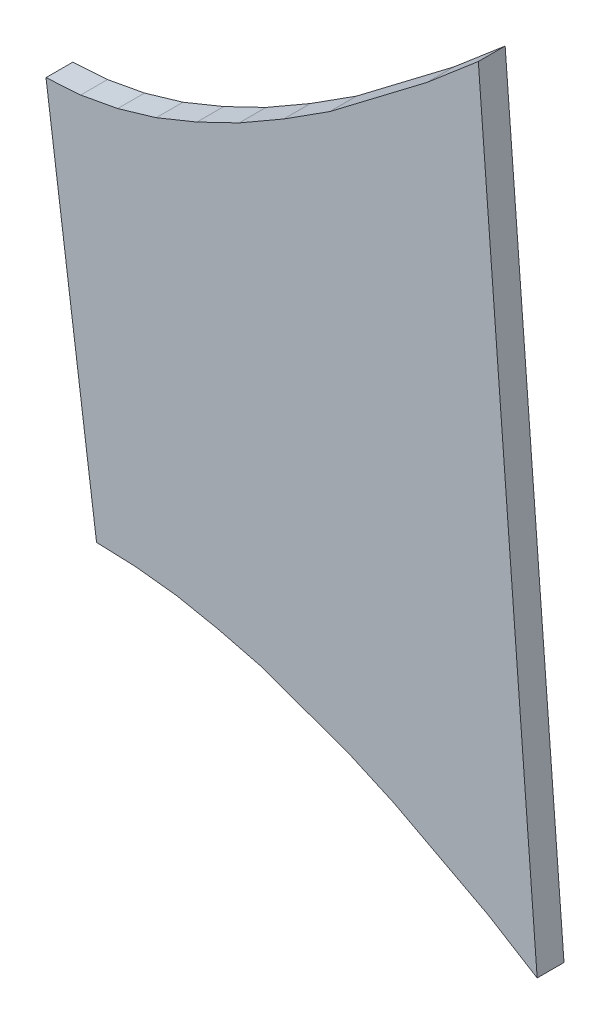
ISO-10303-21;
HEADER;
FILE_DESCRIPTION(('STEP AP214'),'2;1');
FILE_NAME('part.step','',(''),(''),'','','');
FILE_SCHEMA(('AUTOMOTIVE_DESIGN { 1 0 10303 214 1 1 1 1 }'));
ENDSEC;
DATA;
#1=APPLICATION_CONTEXT('core data for automotive mechanical design processes');
#2=APPLICATION_PROTOCOL_DEFINITION('international standard','automotive_design',2000,#1);
#3=PRODUCT_CONTEXT('',#1,'mechanical');
#4=PRODUCT('Part','Part','',(#3));
#5=PRODUCT_RELATED_PRODUCT_CATEGORY('part','',(#4));
#6=PRODUCT_DEFINITION_FORMATION('','',#4);
#7=PRODUCT_DEFINITION_CONTEXT('part definition',#1,'design');
#8=PRODUCT_DEFINITION('design','',#6,#7);
#9=PRODUCT_DEFINITION_SHAPE('','',#8);
#10=(LENGTH_UNIT() NAMED_UNIT(*) SI_UNIT(.MILLI.,.METRE.));
#11=(NAMED_UNIT(*) PLANE_ANGLE_UNIT() SI_UNIT($,.RADIAN.));
#12=(NAMED_UNIT(*) SI_UNIT($,.STERADIAN.) SOLID_ANGLE_UNIT());
#13=UNCERTAINTY_MEASURE_WITH_UNIT(LENGTH_MEASURE(1.E-05),#10,'distance_accuracy_value','');
#14=(GEOMETRIC_REPRESENTATION_CONTEXT(3) GLOBAL_UNCERTAINTY_ASSIGNED_CONTEXT((#13)) GLOBAL_UNIT_ASSIGNED_CONTEXT((#10,
#11,#12)) REPRESENTATION_CONTEXT('',''));
#15=CARTESIAN_POINT('',(0.,0.,0.));
#16=DIRECTION('',(0.,0.,1.));
#17=DIRECTION('',(1.,0.,0.));
#18=AXIS2_PLACEMENT_3D('',#15,#16,#17);
#19=CARTESIAN_POINT('',(57.4749984741211,95.1719970703125,0.));
#20=DIRECTION('',(0.038410600738388,0.999262040583408,0.));
#21=DIRECTION('',(0.999262040583408,-0.038410600738388,0.));
#22=AXIS2_PLACEMENT_3D('',#19,#20,#21);
#23=PLANE('',#22);
#24=DIRECTION('',(0.999262040583408,-0.038410600738388,0.));
#25=VECTOR('',#24,1.);
#26=CARTESIAN_POINT('',(57.4749984741211,95.1719970703125,0.03556));
#27=LINE('',#26,#25);
#28=CARTESIAN_POINT('',(57.4749984741211,95.1719970703125,0.03556));
#29=VERTEX_POINT('',#28);
#30=CARTESIAN_POINT('',(57.5270004272461,95.1699981689453,0.03556));
#31=VERTEX_POINT('',#30);
#32=EDGE_CURVE('E11',#29,#31,#27,.T.);
#33=ORIENTED_EDGE('',*,*,#32,.F.);
#34=DIRECTION('',(0.,0.,1.));
#35=VECTOR('',#34,1.);
#36=CARTESIAN_POINT('',(57.4749984741211,95.1719970703125,0.));
#37=LINE('',#36,#35);
#38=CARTESIAN_POINT('',(57.4749984741211,95.1719970703125,0.));
#39=VERTEX_POINT('',#38);
#40=EDGE_CURVE('E24',#39,#29,#37,.T.);
#41=ORIENTED_EDGE('',*,*,#40,.F.);
#42=DIRECTION('',(0.999262040583408,-0.038410600738388,0.));
#43=VECTOR('',#42,1.);
#44=CARTESIAN_POINT('',(57.4749984741211,95.1719970703125,0.));
#45=LINE('',#44,#43);
#46=CARTESIAN_POINT('',(57.5270004272461,95.1699981689453,0.));
#47=VERTEX_POINT('',#46);
#48=EDGE_CURVE('E166',#39,#47,#45,.T.);
#49=ORIENTED_EDGE('',*,*,#48,.T.);
#50=DIRECTION('',(0.,0.,1.));
#51=VECTOR('',#50,1.);
#52=CARTESIAN_POINT('',(57.5270004272461,95.1699981689453,0.));
#53=LINE('',#52,#51);
#54=EDGE_CURVE('E37',#47,#31,#53,.T.);
#55=ORIENTED_EDGE('',*,*,#54,.T.);
#56=EDGE_LOOP('',(#33,#41,#49,#55));
#57=FACE_BOUND('',#56,.T.);
#58=ADVANCED_FACE('F17',(#57),#23,.F.);
#59=CARTESIAN_POINT('',(57.5270004272461,95.1699981689453,0.));
#60=DIRECTION('',(0.110369878192597,0.993890582502798,0.));
#61=DIRECTION('',(0.993890582502798,-0.110369878192597,0.));
#62=AXIS2_PLACEMENT_3D('',#59,#60,#61);
#63=PLANE('',#62);
#64=DIRECTION('',(0.993890582502798,-0.110369878192597,0.));
#65=VECTOR('',#64,1.);
#66=CARTESIAN_POINT('',(57.5270004272461,95.1699981689453,0.03556));
#67=LINE('',#66,#65);
#68=CARTESIAN_POINT('',(57.5810012817383,95.1640014648438,0.03556));
#69=VERTEX_POINT('',#68);
#70=EDGE_CURVE('E294',#31,#69,#67,.T.);
#71=ORIENTED_EDGE('',*,*,#70,.F.);
#72=ORIENTED_EDGE('',*,*,#54,.F.);
#73=DIRECTION('',(0.993890582502798,-0.110369878192597,0.));
#74=VECTOR('',#73,1.);
#75=CARTESIAN_POINT('',(57.5270004272461,95.1699981689453,0.));
#76=LINE('',#75,#74);
#77=CARTESIAN_POINT('',(57.5810012817383,95.1640014648438,0.));
#78=VERTEX_POINT('',#77);
#79=EDGE_CURVE('E291',#47,#78,#76,.T.);
#80=ORIENTED_EDGE('',*,*,#79,.T.);
#81=DIRECTION('',(0.,0.,1.));
#82=VECTOR('',#81,1.);
#83=CARTESIAN_POINT('',(57.5810012817383,95.1640014648438,0.));
#84=LINE('',#83,#82);
#85=EDGE_CURVE('E289',#78,#69,#84,.T.);
#86=ORIENTED_EDGE('',*,*,#85,.T.);
#87=EDGE_LOOP('',(#71,#72,#80,#86));
#88=FACE_BOUND('',#87,.T.);
#89=ADVANCED_FACE('F302',(#88),#63,.F.);
#90=CARTESIAN_POINT('',(57.5810012817383,95.1640014648438,0.));
#91=DIRECTION('',(0.196142292954482,0.980575443764812,0.));
#92=DIRECTION('',(0.980575443764812,-0.196142292954482,0.));
#93=AXIS2_PLACEMENT_3D('',#90,#91,#92);
#94=PLANE('',#93);
#95=DIRECTION('',(0.980575443764812,-0.196142292954482,0.));
#96=VECTOR('',#95,1.);
#97=CARTESIAN_POINT('',(57.5810012817383,95.1640014648438,0.03556));
#98=LINE('',#97,#96);
#99=CARTESIAN_POINT('',(57.6360015869141,95.1529998779297,0.03556));
#100=VERTEX_POINT('',#99);
#101=EDGE_CURVE('E286',#69,#100,#98,.T.);
#102=ORIENTED_EDGE('',*,*,#101,.F.);
#103=ORIENTED_EDGE('',*,*,#85,.F.);
#104=DIRECTION('',(0.980575443764812,-0.196142292954482,0.));
#105=VECTOR('',#104,1.);
#106=CARTESIAN_POINT('',(57.5810012817383,95.1640014648438,0.));
#107=LINE('',#106,#105);
#108=CARTESIAN_POINT('',(57.6360015869141,95.1529998779297,0.));
#109=VERTEX_POINT('',#108);
#110=EDGE_CURVE('E283',#78,#109,#107,.T.);
#111=ORIENTED_EDGE('',*,*,#110,.T.);
#112=DIRECTION('',(0.,0.,1.));
#113=VECTOR('',#112,1.);
#114=CARTESIAN_POINT('',(57.6360015869141,95.1529998779297,0.));
#115=LINE('',#114,#113);
#116=EDGE_CURVE('E281',#109,#100,#115,.T.);
#117=ORIENTED_EDGE('',*,*,#116,.T.);
#118=EDGE_LOOP('',(#102,#103,#111,#117));
#119=FACE_BOUND('',#118,.T.);
#120=ADVANCED_FACE('F308',(#119),#94,.F.);
#121=CARTESIAN_POINT('',(57.6360015869141,95.1529998779297,0.));
#122=DIRECTION('',(0.242535625036333,0.970142500145332,0.));
#123=DIRECTION('',(0.970142500145332,-0.242535625036333,0.));
#124=AXIS2_PLACEMENT_3D('',#121,#122,#123);
#125=PLANE('',#124);
#126=DIRECTION('',(0.970142500145332,-0.242535625036333,0.));
#127=VECTOR('',#126,1.);
#128=CARTESIAN_POINT('',(57.6360015869141,95.1529998779297,0.03556));
#129=LINE('',#128,#127);
#130=CARTESIAN_POINT('',(57.6920013427734,95.1389999389648,0.03556));
#131=VERTEX_POINT('',#130);
#132=EDGE_CURVE('E278',#100,#131,#129,.T.);
#133=ORIENTED_EDGE('',*,*,#132,.F.);
#134=ORIENTED_EDGE('',*,*,#116,.F.);
#135=DIRECTION('',(0.970142500145332,-0.242535625036333,0.));
#136=VECTOR('',#135,1.);
#137=CARTESIAN_POINT('',(57.6360015869141,95.1529998779297,0.));
#138=LINE('',#137,#136);
#139=CARTESIAN_POINT('',(57.6920013427734,95.1389999389648,0.));
#140=VERTEX_POINT('',#139);
#141=EDGE_CURVE('E275',#109,#140,#138,.T.);
#142=ORIENTED_EDGE('',*,*,#141,.T.);
#143=DIRECTION('',(0.,0.,1.));
#144=VECTOR('',#143,1.);
#145=CARTESIAN_POINT('',(57.6920013427734,95.1389999389648,0.));
#146=LINE('',#145,#144);
#147=EDGE_CURVE('E273',#140,#131,#146,.T.);
#148=ORIENTED_EDGE('',*,*,#147,.T.);
#149=EDGE_LOOP('',(#133,#134,#142,#148));
#150=FACE_BOUND('',#149,.T.);
#151=ADVANCED_FACE('F310',(#150),#125,.F.);
#152=CARTESIAN_POINT('',(57.6920013427734,95.1389999389648,0.));
#153=DIRECTION('',(0.337871724015793,0.941192168534458,0.));
#154=DIRECTION('',(0.941192168534458,-0.337871724015793,0.));
#155=AXIS2_PLACEMENT_3D('',#152,#153,#154);
#156=PLANE('',#155);
#157=DIRECTION('',(0.941192168534458,-0.337871724015793,0.));
#158=VECTOR('',#157,1.);
#159=CARTESIAN_POINT('',(57.6920013427734,95.1389999389648,0.03556));
#160=LINE('',#159,#158);
#161=CARTESIAN_POINT('',(57.8089981079102,95.0970001220703,0.03556));
#162=VERTEX_POINT('',#161);
#163=EDGE_CURVE('E270',#131,#162,#160,.T.);
#164=ORIENTED_EDGE('',*,*,#163,.F.);
#165=ORIENTED_EDGE('',*,*,#147,.F.);
#166=DIRECTION('',(0.941192168534458,-0.337871724015793,0.));
#167=VECTOR('',#166,1.);
#168=CARTESIAN_POINT('',(57.6920013427734,95.1389999389648,0.));
#169=LINE('',#168,#167);
#170=CARTESIAN_POINT('',(57.8089981079102,95.0970001220703,0.));
#171=VERTEX_POINT('',#170);
#172=EDGE_CURVE('E267',#140,#171,#169,.T.);
#173=ORIENTED_EDGE('',*,*,#172,.T.);
#174=DIRECTION('',(0.,0.,1.));
#175=VECTOR('',#174,1.);
#176=CARTESIAN_POINT('',(57.8089981079102,95.0970001220703,0.));
#177=LINE('',#176,#175);
#178=EDGE_CURVE('E265',#171,#162,#177,.T.);
#179=ORIENTED_EDGE('',*,*,#178,.T.);
#180=EDGE_LOOP('',(#164,#165,#173,#179));
#181=FACE_BOUND('',#180,.T.);
#182=ADVANCED_FACE('F315',(#181),#156,.F.);
#183=CARTESIAN_POINT('',(57.8089981079102,95.0970001220703,0.));
#184=DIRECTION('',(0.410362266635063,0.911922589983456,0.));
#185=DIRECTION('',(0.911922589983456,-0.410362266635063,0.));
#186=AXIS2_PLACEMENT_3D('',#183,#184,#185);
#187=PLANE('',#186);
#188=DIRECTION('',(0.911922589983456,-0.410362266635063,0.));
#189=VECTOR('',#188,1.);
#190=CARTESIAN_POINT('',(57.8089981079102,95.0970001220703,0.03556));
#191=LINE('',#190,#189);
#192=CARTESIAN_POINT('',(57.8689994812012,95.0699996948242,0.03556));
#193=VERTEX_POINT('',#192);
#194=EDGE_CURVE('E262',#162,#193,#191,.T.);
#195=ORIENTED_EDGE('',*,*,#194,.F.);
#196=ORIENTED_EDGE('',*,*,#178,.F.);
#197=DIRECTION('',(0.911922589983456,-0.410362266635063,0.));
#198=VECTOR('',#197,1.);
#199=CARTESIAN_POINT('',(57.8089981079102,95.0970001220703,0.));
#200=LINE('',#199,#198);
#201=CARTESIAN_POINT('',(57.8689994812012,95.0699996948242,0.));
#202=VERTEX_POINT('',#201);
#203=EDGE_CURVE('E259',#171,#202,#200,.T.);
#204=ORIENTED_EDGE('',*,*,#203,.T.);
#205=DIRECTION('',(0.,0.,1.));
#206=VECTOR('',#205,1.);
#207=CARTESIAN_POINT('',(57.8689994812012,95.0699996948242,0.));
#208=LINE('',#207,#206);
#209=EDGE_CURVE('E257',#202,#193,#208,.T.);
#210=ORIENTED_EDGE('',*,*,#209,.T.);
#211=EDGE_LOOP('',(#195,#196,#204,#210));
#212=FACE_BOUND('',#211,.T.);
#213=ADVANCED_FACE('F318',(#212),#187,.F.);
#214=CARTESIAN_POINT('',(57.8689994812012,95.0699996948242,0.));
#215=DIRECTION('',(0.466922778862431,0.884298093732756,0.));
#216=DIRECTION('',(0.884298093732756,-0.466922778862431,0.));
#217=AXIS2_PLACEMENT_3D('',#214,#215,#216);
#218=PLANE('',#217);
#219=DIRECTION('',(0.884298093732756,-0.466922778862431,0.));
#220=VECTOR('',#219,1.);
#221=CARTESIAN_POINT('',(57.8689994812012,95.0699996948242,0.03556));
#222=LINE('',#221,#220);
#223=CARTESIAN_POINT('',(57.9939994812012,95.0039978027344,0.03556));
#224=VERTEX_POINT('',#223);
#225=EDGE_CURVE('E254',#193,#224,#222,.T.);
#226=ORIENTED_EDGE('',*,*,#225,.F.);
#227=ORIENTED_EDGE('',*,*,#209,.F.);
#228=DIRECTION('',(0.884298093732756,-0.466922778862431,0.));
#229=VECTOR('',#228,1.);
#230=CARTESIAN_POINT('',(57.8689994812012,95.0699996948242,0.));
#231=LINE('',#230,#229);
#232=CARTESIAN_POINT('',(57.9939994812012,95.0039978027344,0.));
#233=VERTEX_POINT('',#232);
#234=EDGE_CURVE('E251',#202,#233,#231,.T.);
#235=ORIENTED_EDGE('',*,*,#234,.T.);
#236=DIRECTION('',(0.,0.,1.));
#237=VECTOR('',#236,1.);
#238=CARTESIAN_POINT('',(57.9939994812012,95.0039978027344,0.));
#239=LINE('',#238,#237);
#240=EDGE_CURVE('E249',#233,#224,#239,.T.);
#241=ORIENTED_EDGE('',*,*,#240,.T.);
#242=EDGE_LOOP('',(#226,#227,#235,#241));
#243=FACE_BOUND('',#242,.T.);
#244=ADVANCED_FACE('F323',(#243),#218,.F.);
#245=CARTESIAN_POINT('',(57.9939994812012,95.0039978027344,0.));
#246=DIRECTION('',(0.524114157827628,0.851648019762059,0.));
#247=DIRECTION('',(0.851648019762059,-0.524114157827628,0.));
#248=AXIS2_PLACEMENT_3D('',#245,#246,#247);
#249=PLANE('',#248);
#250=DIRECTION('',(0.851648019762059,-0.524114157827628,0.));
#251=VECTOR('',#250,1.);
#252=CARTESIAN_POINT('',(57.9939994812012,95.0039978027344,0.03556));
#253=LINE('',#252,#251);
#254=CARTESIAN_POINT('',(58.0589981079102,94.963996887207,0.03556));
#255=VERTEX_POINT('',#254);
#256=EDGE_CURVE('E246',#224,#255,#253,.T.);
#257=ORIENTED_EDGE('',*,*,#256,.F.);
#258=ORIENTED_EDGE('',*,*,#240,.F.);
#259=DIRECTION('',(0.851648019762059,-0.524114157827628,0.));
#260=VECTOR('',#259,1.);
#261=CARTESIAN_POINT('',(57.9939994812012,95.0039978027344,0.));
#262=LINE('',#261,#260);
#263=CARTESIAN_POINT('',(58.0589981079102,94.963996887207,0.));
#264=VERTEX_POINT('',#263);
#265=EDGE_CURVE('E243',#233,#264,#262,.T.);
#266=ORIENTED_EDGE('',*,*,#265,.T.);
#267=DIRECTION('',(0.,0.,1.));
#268=VECTOR('',#267,1.);
#269=CARTESIAN_POINT('',(58.0589981079102,94.963996887207,0.));
#270=LINE('',#269,#268);
#271=EDGE_CURVE('E241',#264,#255,#270,.T.);
#272=ORIENTED_EDGE('',*,*,#271,.T.);
#273=EDGE_LOOP('',(#257,#258,#266,#272));
#274=FACE_BOUND('',#273,.T.);
#275=ADVANCED_FACE('F326',(#274),#249,.F.);
#276=CARTESIAN_POINT('',(58.0589981079102,94.963996887207,0.));
#277=DIRECTION('',(-0.997048762443462,-0.0767708623760374,0.));
#278=DIRECTION('',(-0.0767708623760374,0.997048762443462,0.));
#279=AXIS2_PLACEMENT_3D('',#276,#277,#278);
#280=PLANE('',#279);
#281=DIRECTION('',(-0.0767708623760373,0.997048762443462,0.));
#282=VECTOR('',#281,1.);
#283=CARTESIAN_POINT('',(58.0589981079102,94.963996887207,0.03556));
#284=LINE('',#283,#282);
#285=CARTESIAN_POINT('',(57.9809989929199,95.9769973754883,0.03556));
#286=VERTEX_POINT('',#285);
#287=EDGE_CURVE('E238',#255,#286,#284,.T.);
#288=ORIENTED_EDGE('',*,*,#287,.F.);
#289=ORIENTED_EDGE('',*,*,#271,.F.);
#290=DIRECTION('',(-0.0767708623760373,0.997048762443462,0.));
#291=VECTOR('',#290,1.);
#292=CARTESIAN_POINT('',(58.0589981079102,94.963996887207,0.));
#293=LINE('',#292,#291);
#294=CARTESIAN_POINT('',(57.9809989929199,95.9769973754883,0.));
#295=VERTEX_POINT('',#294);
#296=EDGE_CURVE('E235',#264,#295,#293,.T.);
#297=ORIENTED_EDGE('',*,*,#296,.T.);
#298=DIRECTION('',(0.,0.,1.));
#299=VECTOR('',#298,1.);
#300=CARTESIAN_POINT('',(57.9809989929199,95.9769973754883,0.));
#301=LINE('',#300,#299);
#302=EDGE_CURVE('E233',#295,#286,#301,.T.);
#303=ORIENTED_EDGE('',*,*,#302,.T.);
#304=EDGE_LOOP('',(#288,#289,#297,#303));
#305=FACE_BOUND('',#304,.T.);
#306=ADVANCED_FACE('F331',(#305),#280,.F.);
#307=CARTESIAN_POINT('',(57.9809989929199,95.9769973754883,0.));
#308=DIRECTION('',(0.648933525746987,-0.760845108521823,0.));
#309=DIRECTION('',(-0.760845108521823,-0.648933525746987,0.));
#310=AXIS2_PLACEMENT_3D('',#307,#308,#309);
#311=PLANE('',#310);
#312=DIRECTION('',(-0.760845108521823,-0.648933525746987,0.));
#313=VECTOR('',#312,1.);
#314=CARTESIAN_POINT('',(57.9809989929199,95.9769973754883,0.03556));
#315=LINE('',#314,#313);
#316=CARTESIAN_POINT('',(57.9129981994629,95.9189987182617,0.03556));
#317=VERTEX_POINT('',#316);
#318=EDGE_CURVE('E230',#286,#317,#315,.T.);
#319=ORIENTED_EDGE('',*,*,#318,.F.);
#320=ORIENTED_EDGE('',*,*,#302,.F.);
#321=DIRECTION('',(-0.760845108521823,-0.648933525746987,0.));
#322=VECTOR('',#321,1.);
#323=CARTESIAN_POINT('',(57.9809989929199,95.9769973754883,0.));
#324=LINE('',#323,#322);
#325=CARTESIAN_POINT('',(57.9129981994629,95.9189987182617,0.));
#326=VERTEX_POINT('',#325);
#327=EDGE_CURVE('E227',#295,#326,#324,.T.);
#328=ORIENTED_EDGE('',*,*,#327,.T.);
#329=DIRECTION('',(0.,0.,1.));
#330=VECTOR('',#329,1.);
#331=CARTESIAN_POINT('',(57.9129981994629,95.9189987182617,0.));
#332=LINE('',#331,#330);
#333=EDGE_CURVE('E225',#326,#317,#332,.T.);
#334=ORIENTED_EDGE('',*,*,#333,.T.);
#335=EDGE_LOOP('',(#319,#320,#328,#334));
#336=FACE_BOUND('',#335,.T.);
#337=ADVANCED_FACE('F334',(#336),#311,.F.);
#338=CARTESIAN_POINT('',(57.9129981994629,95.9189987182617,0.));
#339=DIRECTION('',(0.604931607755393,-0.796277432769808,0.));
#340=DIRECTION('',(-0.796277432769808,-0.604931607755393,0.));
#341=AXIS2_PLACEMENT_3D('',#338,#339,#340);
#342=PLANE('',#341);
#343=DIRECTION('',(-0.796277432769808,-0.604931607755393,0.));
#344=VECTOR('',#343,1.);
#345=CARTESIAN_POINT('',(57.9129981994629,95.9189987182617,0.03556));
#346=LINE('',#345,#344);
#347=CARTESIAN_POINT('',(57.7840003967285,95.8209991455078,0.03556));
#348=VERTEX_POINT('',#347);
#349=EDGE_CURVE('E222',#317,#348,#346,.T.);
#350=ORIENTED_EDGE('',*,*,#349,.F.);
#351=ORIENTED_EDGE('',*,*,#333,.F.);
#352=DIRECTION('',(-0.796277432769808,-0.604931607755393,0.));
#353=VECTOR('',#352,1.);
#354=CARTESIAN_POINT('',(57.9129981994629,95.9189987182617,0.));
#355=LINE('',#354,#353);
#356=CARTESIAN_POINT('',(57.7840003967285,95.8209991455078,0.));
#357=VERTEX_POINT('',#356);
#358=EDGE_CURVE('E219',#326,#357,#355,.T.);
#359=ORIENTED_EDGE('',*,*,#358,.T.);
#360=DIRECTION('',(0.,0.,1.));
#361=VECTOR('',#360,1.);
#362=CARTESIAN_POINT('',(57.7840003967285,95.8209991455078,0.));
#363=LINE('',#362,#361);
#364=EDGE_CURVE('E217',#357,#348,#363,.T.);
#365=ORIENTED_EDGE('',*,*,#364,.T.);
#366=EDGE_LOOP('',(#350,#351,#359,#365));
#367=FACE_BOUND('',#366,.T.);
#368=ADVANCED_FACE('F339',(#367),#342,.F.);
#369=CARTESIAN_POINT('',(57.7840003967285,95.8209991455078,0.));
#370=DIRECTION('',(0.538670898224396,-0.842516268926674,0.));
#371=DIRECTION('',(-0.842516268926674,-0.538670898224396,0.));
#372=AXIS2_PLACEMENT_3D('',#369,#370,#371);
#373=PLANE('',#372);
#374=DIRECTION('',(-0.842516268926674,-0.538670898224396,0.));
#375=VECTOR('',#374,1.);
#376=CARTESIAN_POINT('',(57.7840003967285,95.8209991455078,0.03556));
#377=LINE('',#376,#375);
#378=CARTESIAN_POINT('',(57.7229995727539,95.7819976806641,0.03556));
#379=VERTEX_POINT('',#378);
#380=EDGE_CURVE('E214',#348,#379,#377,.T.);
#381=ORIENTED_EDGE('',*,*,#380,.F.);
#382=ORIENTED_EDGE('',*,*,#364,.F.);
#383=DIRECTION('',(-0.842516268926674,-0.538670898224396,0.));
#384=VECTOR('',#383,1.);
#385=CARTESIAN_POINT('',(57.7840003967285,95.8209991455078,0.));
#386=LINE('',#385,#384);
#387=CARTESIAN_POINT('',(57.7229995727539,95.7819976806641,0.));
#388=VERTEX_POINT('',#387);
#389=EDGE_CURVE('E211',#357,#388,#386,.T.);
#390=ORIENTED_EDGE('',*,*,#389,.T.);
#391=DIRECTION('',(0.,0.,1.));
#392=VECTOR('',#391,1.);
#393=CARTESIAN_POINT('',(57.7229995727539,95.7819976806641,0.));
#394=LINE('',#393,#392);
#395=EDGE_CURVE('E209',#388,#379,#394,.T.);
#396=ORIENTED_EDGE('',*,*,#395,.T.);
#397=EDGE_LOOP('',(#381,#382,#390,#396));
#398=FACE_BOUND('',#397,.T.);
#399=ADVANCED_FACE('F342',(#398),#373,.F.);
#400=CARTESIAN_POINT('',(57.7229995727539,95.7819976806641,0.));
#401=DIRECTION('',(0.499272962263717,-0.866444752510172,0.));
#402=DIRECTION('',(-0.866444752510172,-0.499272962263717,0.));
#403=AXIS2_PLACEMENT_3D('',#400,#401,#402);
#404=PLANE('',#403);
#405=DIRECTION('',(-0.866444752510172,-0.499272962263717,0.));
#406=VECTOR('',#405,1.);
#407=CARTESIAN_POINT('',(57.7229995727539,95.7819976806641,0.03556));
#408=LINE('',#407,#406);
#409=CARTESIAN_POINT('',(57.6640014648437,95.7480010986328,0.03556));
#410=VERTEX_POINT('',#409);
#411=EDGE_CURVE('E206',#379,#410,#408,.T.);
#412=ORIENTED_EDGE('',*,*,#411,.F.);
#413=ORIENTED_EDGE('',*,*,#395,.F.);
#414=DIRECTION('',(-0.866444752510172,-0.499272962263717,0.));
#415=VECTOR('',#414,1.);
#416=CARTESIAN_POINT('',(57.7229995727539,95.7819976806641,0.));
#417=LINE('',#416,#415);
#418=CARTESIAN_POINT('',(57.6640014648437,95.7480010986328,0.));
#419=VERTEX_POINT('',#418);
#420=EDGE_CURVE('E203',#388,#419,#417,.T.);
#421=ORIENTED_EDGE('',*,*,#420,.T.);
#422=DIRECTION('',(0.,0.,1.));
#423=VECTOR('',#422,1.);
#424=CARTESIAN_POINT('',(57.6640014648437,95.7480010986328,0.));
#425=LINE('',#424,#423);
#426=EDGE_CURVE('E201',#419,#410,#425,.T.);
#427=ORIENTED_EDGE('',*,*,#426,.T.);
#428=EDGE_LOOP('',(#412,#413,#421,#427));
#429=FACE_BOUND('',#428,.T.);
#430=ADVANCED_FACE('F347',(#429),#404,.F.);
#431=CARTESIAN_POINT('',(57.6640014648437,95.7480010986328,0.));
#432=DIRECTION('',(0.43430629801226,-0.90076525216445,0.));
#433=DIRECTION('',(-0.90076525216445,-0.43430629801226,0.));
#434=AXIS2_PLACEMENT_3D('',#431,#432,#433);
#435=PLANE('',#434);
#436=DIRECTION('',(-0.90076525216445,-0.43430629801226,0.));
#437=VECTOR('',#436,1.);
#438=CARTESIAN_POINT('',(57.6640014648437,95.7480010986328,0.03556));
#439=LINE('',#438,#437);
#440=CARTESIAN_POINT('',(57.6080017089844,95.7210006713867,0.03556));
#441=VERTEX_POINT('',#440);
#442=EDGE_CURVE('E198',#410,#441,#439,.T.);
#443=ORIENTED_EDGE('',*,*,#442,.F.);
#444=ORIENTED_EDGE('',*,*,#426,.F.);
#445=DIRECTION('',(-0.90076525216445,-0.43430629801226,0.));
#446=VECTOR('',#445,1.);
#447=CARTESIAN_POINT('',(57.6640014648437,95.7480010986328,0.));
#448=LINE('',#447,#446);
#449=CARTESIAN_POINT('',(57.6080017089844,95.7210006713867,0.));
#450=VERTEX_POINT('',#449);
#451=EDGE_CURVE('E195',#419,#450,#448,.T.);
#452=ORIENTED_EDGE('',*,*,#451,.T.);
#453=DIRECTION('',(0.,0.,1.));
#454=VECTOR('',#453,1.);
#455=CARTESIAN_POINT('',(57.6080017089844,95.7210006713867,0.));
#456=LINE('',#455,#454);
#457=EDGE_CURVE('E193',#450,#441,#456,.T.);
#458=ORIENTED_EDGE('',*,*,#457,.T.);
#459=EDGE_LOOP('',(#443,#444,#452,#458));
#460=FACE_BOUND('',#459,.T.);
#461=ADVANCED_FACE('F350',(#460),#435,.F.);
#462=CARTESIAN_POINT('',(57.6080017089844,95.7210006713867,0.));
#463=DIRECTION('',(0.3773384474218,-0.926075426786234,0.));
#464=DIRECTION('',(-0.926075426786234,-0.3773384474218,0.));
#465=AXIS2_PLACEMENT_3D('',#462,#463,#464);
#466=PLANE('',#465);
#467=DIRECTION('',(-0.926075426786234,-0.3773384474218,0.));
#468=VECTOR('',#467,1.);
#469=CARTESIAN_POINT('',(57.6080017089844,95.7210006713867,0.03556));
#470=LINE('',#469,#468);
#471=CARTESIAN_POINT('',(57.5540008544922,95.6989974975586,0.03556));
#472=VERTEX_POINT('',#471);
#473=EDGE_CURVE('E190',#441,#472,#470,.T.);
#474=ORIENTED_EDGE('',*,*,#473,.F.);
#475=ORIENTED_EDGE('',*,*,#457,.F.);
#476=DIRECTION('',(-0.926075426786234,-0.3773384474218,0.));
#477=VECTOR('',#476,1.);
#478=CARTESIAN_POINT('',(57.6080017089844,95.7210006713867,0.));
#479=LINE('',#478,#477);
#480=CARTESIAN_POINT('',(57.5540008544922,95.6989974975586,0.));
#481=VERTEX_POINT('',#480);
#482=EDGE_CURVE('E187',#450,#481,#479,.T.);
#483=ORIENTED_EDGE('',*,*,#482,.T.);
#484=DIRECTION('',(0.,0.,1.));
#485=VECTOR('',#484,1.);
#486=CARTESIAN_POINT('',(57.5540008544922,95.6989974975586,0.));
#487=LINE('',#486,#485);
#488=EDGE_CURVE('E185',#481,#472,#487,.T.);
#489=ORIENTED_EDGE('',*,*,#488,.T.);
#490=EDGE_LOOP('',(#474,#475,#483,#489));
#491=FACE_BOUND('',#490,.T.);
#492=ADVANCED_FACE('F355',(#491),#466,.F.);
#493=CARTESIAN_POINT('',(57.5540008544922,95.6989974975586,0.));
#494=DIRECTION('',(0.282143014764684,-0.959372356918572,0.));
#495=DIRECTION('',(-0.959372356918572,-0.282143014764684,0.));
#496=AXIS2_PLACEMENT_3D('',#493,#494,#495);
#497=PLANE('',#496);
#498=DIRECTION('',(-0.959372356918572,-0.282143014764684,0.));
#499=VECTOR('',#498,1.);
#500=CARTESIAN_POINT('',(57.5540008544922,95.6989974975586,0.03556));
#501=LINE('',#500,#499);
#502=CARTESIAN_POINT('',(57.5029983520508,95.6839981079102,0.03556));
#503=VERTEX_POINT('',#502);
#504=EDGE_CURVE('E182',#472,#503,#501,.T.);
#505=ORIENTED_EDGE('',*,*,#504,.F.);
#506=ORIENTED_EDGE('',*,*,#488,.F.);
#507=DIRECTION('',(-0.959372356918572,-0.282143014764684,0.));
#508=VECTOR('',#507,1.);
#509=CARTESIAN_POINT('',(57.5540008544922,95.6989974975586,0.));
#510=LINE('',#509,#508);
#511=CARTESIAN_POINT('',(57.5029983520508,95.6839981079102,0.));
#512=VERTEX_POINT('',#511);
#513=EDGE_CURVE('E179',#481,#512,#510,.T.);
#514=ORIENTED_EDGE('',*,*,#513,.T.);
#515=DIRECTION('',(0.,0.,1.));
#516=VECTOR('',#515,1.);
#517=CARTESIAN_POINT('',(57.5029983520508,95.6839981079102,0.));
#518=LINE('',#517,#516);
#519=EDGE_CURVE('E177',#512,#503,#518,.T.);
#520=ORIENTED_EDGE('',*,*,#519,.T.);
#521=EDGE_LOOP('',(#505,#506,#514,#520));
#522=FACE_BOUND('',#521,.T.);
#523=ADVANCED_FACE('F358',(#522),#497,.F.);
#524=CARTESIAN_POINT('',(57.5029983520508,95.6839981079102,0.));
#525=DIRECTION('',(0.180556282930878,-0.983564654048825,0.));
#526=DIRECTION('',(-0.983564654048825,-0.180556282930878,0.));
#527=AXIS2_PLACEMENT_3D('',#524,#525,#526);
#528=PLANE('',#527);
#529=DIRECTION('',(-0.983564654048825,-0.180556282930878,0.));
#530=VECTOR('',#529,1.);
#531=CARTESIAN_POINT('',(57.5029983520508,95.6839981079102,0.03556));
#532=LINE('',#531,#530);
#533=CARTESIAN_POINT('',(57.4539985656738,95.6750030517578,0.03556));
#534=VERTEX_POINT('',#533);
#535=EDGE_CURVE('E174',#503,#534,#532,.T.);
#536=ORIENTED_EDGE('',*,*,#535,.F.);
#537=ORIENTED_EDGE('',*,*,#519,.F.);
#538=DIRECTION('',(-0.983564654048825,-0.180556282930878,0.));
#539=VECTOR('',#538,1.);
#540=CARTESIAN_POINT('',(57.5029983520508,95.6839981079102,0.));
#541=LINE('',#540,#539);
#542=CARTESIAN_POINT('',(57.4539985656738,95.6750030517578,0.));
#543=VERTEX_POINT('',#542);
#544=EDGE_CURVE('E172',#512,#543,#541,.T.);
#545=ORIENTED_EDGE('',*,*,#544,.T.);
#546=DIRECTION('',(0.,0.,1.));
#547=VECTOR('',#546,1.);
#548=CARTESIAN_POINT('',(57.4539985656738,95.6750030517578,0.));
#549=LINE('',#548,#547);
#550=EDGE_CURVE('E157',#543,#534,#549,.T.);
#551=ORIENTED_EDGE('',*,*,#550,.T.);
#552=EDGE_LOOP('',(#536,#537,#545,#551));
#553=FACE_BOUND('',#552,.T.);
#554=ADVANCED_FACE('F361',(#553),#528,.F.);
#555=CARTESIAN_POINT('',(57.4539985656738,95.6750030517578,0.));
#556=DIRECTION('',(0.0652117020946669,-0.997871451595804,0.));
#557=DIRECTION('',(-0.997871451595804,-0.0652117020946669,0.));
#558=AXIS2_PLACEMENT_3D('',#555,#556,#557);
#559=PLANE('',#558);
#560=DIRECTION('',(-0.997871451595804,-0.0652117020946669,0.));
#561=VECTOR('',#560,1.);
#562=CARTESIAN_POINT('',(57.4539985656738,95.6750030517578,0.03556));
#563=LINE('',#562,#561);
#564=CARTESIAN_POINT('',(57.4080009460449,95.6719970703125,0.03556));
#565=VERTEX_POINT('',#564);
#566=EDGE_CURVE('E161',#534,#565,#563,.T.);
#567=ORIENTED_EDGE('',*,*,#566,.F.);
#568=ORIENTED_EDGE('',*,*,#550,.F.);
#569=DIRECTION('',(-0.997871451595804,-0.0652117020946669,0.));
#570=VECTOR('',#569,1.);
#571=CARTESIAN_POINT('',(57.4539985656738,95.6750030517578,0.));
#572=LINE('',#571,#570);
#573=CARTESIAN_POINT('',(57.4080009460449,95.6719970703125,0.));
#574=VERTEX_POINT('',#573);
#575=EDGE_CURVE('E153',#543,#574,#572,.T.);
#576=ORIENTED_EDGE('',*,*,#575,.T.);
#577=DIRECTION('',(0.,0.,1.));
#578=VECTOR('',#577,1.);
#579=CARTESIAN_POINT('',(57.4080009460449,95.6719970703125,0.));
#580=LINE('',#579,#578);
#581=EDGE_CURVE('E143',#574,#565,#580,.T.);
#582=ORIENTED_EDGE('',*,*,#581,.T.);
#583=EDGE_LOOP('',(#567,#568,#576,#582));
#584=FACE_BOUND('',#583,.T.);
#585=ADVANCED_FACE('F156',(#584),#559,.F.);
#586=CARTESIAN_POINT('',(57.4080009460449,95.6719970703125,0.));
#587=DIRECTION('',(0.99114177054464,0.132808097199063,0.));
#588=DIRECTION('',(0.132808097199063,-0.99114177054464,0.));
#589=AXIS2_PLACEMENT_3D('',#586,#587,#588);
#590=PLANE('',#589);
#591=DIRECTION('',(0.132808097199063,-0.99114177054464,0.));
#592=VECTOR('',#591,1.);
#593=CARTESIAN_POINT('',(57.4080009460449,95.6719970703125,0.03556));
#594=LINE('',#593,#592);
#595=EDGE_CURVE('E149',#565,#29,#594,.T.);
#596=ORIENTED_EDGE('',*,*,#595,.F.);
#597=ORIENTED_EDGE('',*,*,#581,.F.);
#598=DIRECTION('',(0.132808097199063,-0.99114177054464,0.));
#599=VECTOR('',#598,1.);
#600=CARTESIAN_POINT('',(57.4080009460449,95.6719970703125,0.));
#601=LINE('',#600,#599);
#602=EDGE_CURVE('E147',#574,#39,#601,.T.);
#603=ORIENTED_EDGE('',*,*,#602,.T.);
#604=ORIENTED_EDGE('',*,*,#40,.T.);
#605=EDGE_LOOP('',(#596,#597,#603,#604));
#606=FACE_BOUND('',#605,.T.);
#607=ADVANCED_FACE('F145',(#606),#590,.F.);
#608=CARTESIAN_POINT('',(57.4749984741211,95.1719970703125,0.));
#609=DIRECTION('',(0.,0.,1.));
#610=DIRECTION('',(1.,0.,0.));
#611=AXIS2_PLACEMENT_3D('',#608,#609,#610);
#612=PLANE('',#611);
#613=ORIENTED_EDGE('',*,*,#602,.F.);
#614=ORIENTED_EDGE('',*,*,#575,.F.);
#615=ORIENTED_EDGE('',*,*,#544,.F.);
#616=ORIENTED_EDGE('',*,*,#513,.F.);
#617=ORIENTED_EDGE('',*,*,#482,.F.);
#618=ORIENTED_EDGE('',*,*,#451,.F.);
#619=ORIENTED_EDGE('',*,*,#420,.F.);
#620=ORIENTED_EDGE('',*,*,#389,.F.);
#621=ORIENTED_EDGE('',*,*,#358,.F.);
#622=ORIENTED_EDGE('',*,*,#327,.F.);
#623=ORIENTED_EDGE('',*,*,#296,.F.);
#624=ORIENTED_EDGE('',*,*,#265,.F.);
#625=ORIENTED_EDGE('',*,*,#234,.F.);
#626=ORIENTED_EDGE('',*,*,#203,.F.);
#627=ORIENTED_EDGE('',*,*,#172,.F.);
#628=ORIENTED_EDGE('',*,*,#141,.F.);
#629=ORIENTED_EDGE('',*,*,#110,.F.);
#630=ORIENTED_EDGE('',*,*,#79,.F.);
#631=ORIENTED_EDGE('',*,*,#48,.F.);
#632=EDGE_LOOP('',(#613,#614,#615,#616,#617,#618,#619,#620,#621,#622,#623,#624,#625,#626,#627,
#628,#629,#630,#631));
#633=FACE_BOUND('',#632,.T.);
#634=ADVANCED_FACE('F164',(#633),#612,.F.);
#635=CARTESIAN_POINT('',(57.4749984741211,95.1719970703125,0.03556));
#636=DIRECTION('',(0.,0.,1.));
#637=DIRECTION('',(1.,0.,0.));
#638=AXIS2_PLACEMENT_3D('',#635,#636,#637);
#639=PLANE('',#638);
#640=ORIENTED_EDGE('',*,*,#32,.T.);
#641=ORIENTED_EDGE('',*,*,#70,.T.);
#642=ORIENTED_EDGE('',*,*,#101,.T.);
#643=ORIENTED_EDGE('',*,*,#132,.T.);
#644=ORIENTED_EDGE('',*,*,#163,.T.);
#645=ORIENTED_EDGE('',*,*,#194,.T.);
#646=ORIENTED_EDGE('',*,*,#225,.T.);
#647=ORIENTED_EDGE('',*,*,#256,.T.);
#648=ORIENTED_EDGE('',*,*,#287,.T.);
#649=ORIENTED_EDGE('',*,*,#318,.T.);
#650=ORIENTED_EDGE('',*,*,#349,.T.);
#651=ORIENTED_EDGE('',*,*,#380,.T.);
#652=ORIENTED_EDGE('',*,*,#411,.T.);
#653=ORIENTED_EDGE('',*,*,#442,.T.);
#654=ORIENTED_EDGE('',*,*,#473,.T.);
#655=ORIENTED_EDGE('',*,*,#504,.T.);
#656=ORIENTED_EDGE('',*,*,#535,.T.);
#657=ORIENTED_EDGE('',*,*,#566,.T.);
#658=ORIENTED_EDGE('',*,*,#595,.T.);
#659=EDGE_LOOP('',(#640,#641,#642,#643,#644,#645,#646,#647,#648,#649,#650,#651,#652,#653,#654,
#655,#656,#657,#658));
#660=FACE_BOUND('',#659,.T.);
#661=ADVANCED_FACE('F305',(#660),#639,.T.);
#662=CLOSED_SHELL('',(#58,#89,#120,#151,#182,#213,#244,#275,#306,#337,#368,#399,#430,#461,#492,
#523,#554,#585,#607,#634,#661));
#663=MANIFOLD_SOLID_BREP('B1',#662);
#664=ADVANCED_BREP_SHAPE_REPRESENTATION('',(#18,#663),#14);
#665=SHAPE_DEFINITION_REPRESENTATION(#9,#664);
ENDSEC;
END-ISO-10303-21;
